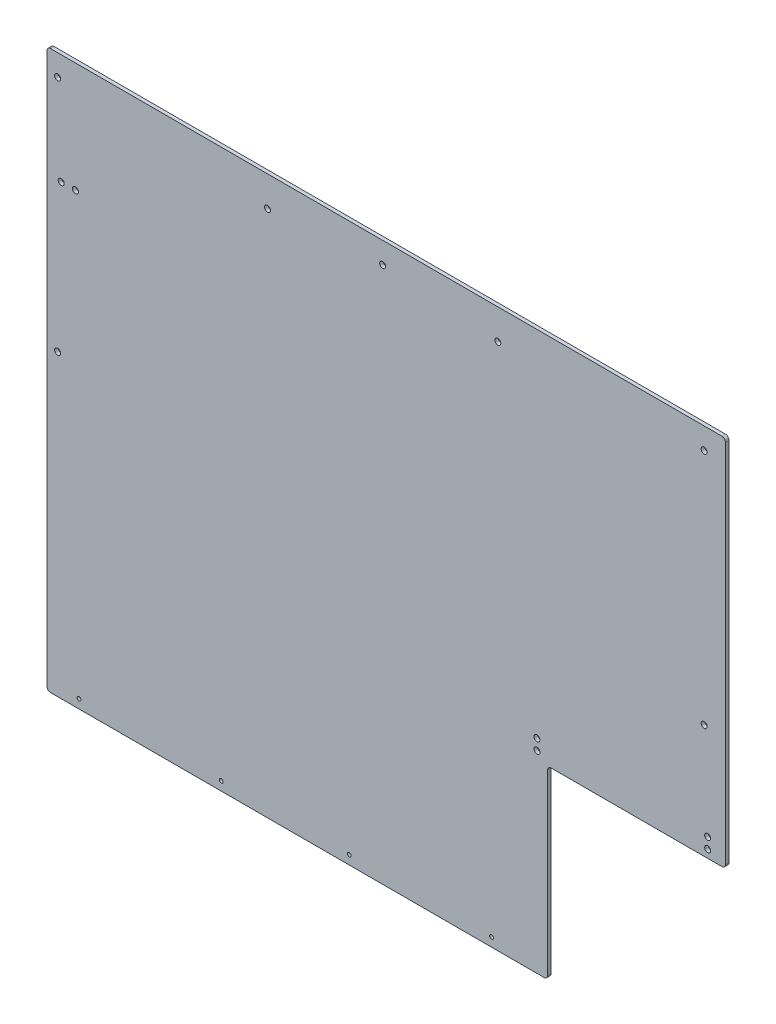
ISO-10303-21;
HEADER;
FILE_DESCRIPTION(('STEP AP214'),'2;1');
FILE_NAME('part.step','',(''),(''),'','','');
FILE_SCHEMA(('AUTOMOTIVE_DESIGN { 1 0 10303 214 1 1 1 1 }'));
ENDSEC;
DATA;
#1=APPLICATION_CONTEXT('core data for automotive mechanical design processes');
#2=APPLICATION_PROTOCOL_DEFINITION('international standard','automotive_design',2000,#1);
#3=PRODUCT_CONTEXT('',#1,'mechanical');
#4=PRODUCT('Part','Part','',(#3));
#5=PRODUCT_RELATED_PRODUCT_CATEGORY('part','',(#4));
#6=PRODUCT_DEFINITION_FORMATION('','',#4);
#7=PRODUCT_DEFINITION_CONTEXT('part definition',#1,'design');
#8=PRODUCT_DEFINITION('design','',#6,#7);
#9=PRODUCT_DEFINITION_SHAPE('','',#8);
#10=(LENGTH_UNIT() NAMED_UNIT(*) SI_UNIT(.MILLI.,.METRE.));
#11=(NAMED_UNIT(*) PLANE_ANGLE_UNIT() SI_UNIT($,.RADIAN.));
#12=(NAMED_UNIT(*) SI_UNIT($,.STERADIAN.) SOLID_ANGLE_UNIT());
#13=UNCERTAINTY_MEASURE_WITH_UNIT(LENGTH_MEASURE(1.E-05),#10,'distance_accuracy_value','');
#14=(GEOMETRIC_REPRESENTATION_CONTEXT(3) GLOBAL_UNCERTAINTY_ASSIGNED_CONTEXT((#13)) GLOBAL_UNIT_ASSIGNED_CONTEXT((#10,
#11,#12)) REPRESENTATION_CONTEXT('',''));
#15=CARTESIAN_POINT('',(0.,0.,0.));
#16=DIRECTION('',(0.,0.,1.));
#17=DIRECTION('',(1.,0.,0.));
#18=AXIS2_PLACEMENT_3D('',#15,#16,#17);
#19=CARTESIAN_POINT('',(611.98125,-988.3775,3.175));
#20=DIRECTION('',(-1.,0.,0.));
#21=DIRECTION('',(0.,0.,1.));
#22=AXIS2_PLACEMENT_3D('',#19,#20,#21);
#23=PLANE('',#22);
#24=DIRECTION('',(0.,1.,0.));
#25=VECTOR('',#24,1.);
#26=CARTESIAN_POINT('',(611.98125,-988.3775,-3.175));
#27=LINE('',#26,#25);
#28=CARTESIAN_POINT('',(611.98125,319.7225,-3.175));
#29=VERTEX_POINT('',#28);
#30=CARTESIAN_POINT('',(611.98125,972.5025,-3.175));
#31=VERTEX_POINT('',#30);
#32=EDGE_CURVE('E163',#29,#31,#27,.T.);
#33=ORIENTED_EDGE('',*,*,#32,.T.);
#34=DIRECTION('',(0.,0.,1.));
#35=VECTOR('',#34,1.);
#36=CARTESIAN_POINT('',(611.98125,972.5025,3.175));
#37=LINE('',#36,#35);
#38=CARTESIAN_POINT('',(611.98125,972.5025,3.175));
#39=VERTEX_POINT('',#38);
#40=EDGE_CURVE('E45',#31,#39,#37,.T.);
#41=ORIENTED_EDGE('',*,*,#40,.T.);
#42=DIRECTION('',(0.,1.,0.));
#43=VECTOR('',#42,1.);
#44=CARTESIAN_POINT('',(611.98125,-988.3775,3.175));
#45=LINE('',#44,#43);
#46=CARTESIAN_POINT('',(611.98125,319.7225,3.175));
#47=VERTEX_POINT('',#46);
#48=EDGE_CURVE('E172',#47,#39,#45,.T.);
#49=ORIENTED_EDGE('',*,*,#48,.F.);
#50=DIRECTION('',(0.,0.,1.));
#51=VECTOR('',#50,1.);
#52=CARTESIAN_POINT('',(611.98125,319.7225,3.175));
#53=LINE('',#52,#51);
#54=EDGE_CURVE('E208',#47,#29,#53,.F.);
#55=ORIENTED_EDGE('',*,*,#54,.T.);
#56=EDGE_LOOP('',(#33,#41,#49,#55));
#57=FACE_BOUND('',#56,.T.);
#58=ADVANCED_FACE('F36',(#57),#23,.F.);
#59=CARTESIAN_POINT('',(0.,0.,3.175));
#60=DIRECTION('',(0.,0.,-1.));
#61=DIRECTION('',(-1.,0.,0.));
#62=AXIS2_PLACEMENT_3D('',#59,#60,#61);
#63=PLANE('',#62);
#64=CARTESIAN_POINT('',(-592.93125,972.5025,3.175));
#65=DIRECTION('',(0.,0.,1.));
#66=DIRECTION('',(1.,0.,0.));
#67=AXIS2_PLACEMENT_3D('',#64,#65,#66);
#68=CIRCLE('',#67,6.35000000000002);
#69=CARTESIAN_POINT('',(-592.93125,978.8525,3.175));
#70=VERTEX_POINT('',#69);
#71=CARTESIAN_POINT('',(-599.28125,972.5025,3.175));
#72=VERTEX_POINT('',#71);
#73=EDGE_CURVE('E52',#70,#72,#68,.T.);
#74=ORIENTED_EDGE('',*,*,#73,.T.);
#75=DIRECTION('',(0.,-1.,0.));
#76=VECTOR('',#75,1.);
#77=CARTESIAN_POINT('',(-599.28125,-1.35371185980619E-13,3.175));
#78=LINE('',#77,#76);
#79=CARTESIAN_POINT('',(-599.28125,-10.4775000000001,3.175));
#80=VERTEX_POINT('',#79);
#81=EDGE_CURVE('E249',#72,#80,#78,.T.);
#82=ORIENTED_EDGE('',*,*,#81,.T.);
#83=CARTESIAN_POINT('',(-592.93125,-10.4775000000001,3.175));
#84=DIRECTION('',(0.,0.,1.));
#85=DIRECTION('',(1.,0.,0.));
#86=AXIS2_PLACEMENT_3D('',#83,#84,#85);
#87=CIRCLE('',#86,6.34999999999993);
#88=CARTESIAN_POINT('',(-592.93125,-16.8275000000001,3.175));
#89=VERTEX_POINT('',#88);
#90=EDGE_CURVE('E241',#89,#80,#87,.F.);
#91=ORIENTED_EDGE('',*,*,#90,.F.);
#92=DIRECTION('',(1.,0.,0.));
#93=VECTOR('',#92,1.);
#94=CARTESIAN_POINT('',(0.,-16.8275,3.175));
#95=LINE('',#94,#93);
#96=CARTESIAN_POINT('',(288.13125,-16.8275,3.175));
#97=VERTEX_POINT('',#96);
#98=EDGE_CURVE('E236',#89,#97,#95,.T.);
#99=ORIENTED_EDGE('',*,*,#98,.T.);
#100=CARTESIAN_POINT('',(288.13125,-10.4775,3.175));
#101=DIRECTION('',(0.,0.,1.));
#102=DIRECTION('',(1.,0.,0.));
#103=AXIS2_PLACEMENT_3D('',#100,#101,#102);
#104=CIRCLE('',#103,6.35000000000001);
#105=CARTESIAN_POINT('',(294.48125,-10.4775,3.175));
#106=VERTEX_POINT('',#105);
#107=EDGE_CURVE('E233',#106,#97,#104,.F.);
#108=ORIENTED_EDGE('',*,*,#107,.F.);
#109=DIRECTION('',(0.,-1.,0.));
#110=VECTOR('',#109,1.);
#111=CARTESIAN_POINT('',(294.48125,313.3725,3.175));
#112=LINE('',#111,#110);
#113=CARTESIAN_POINT('',(294.48125,307.0225,3.175));
#114=VERTEX_POINT('',#113);
#115=EDGE_CURVE('E147',#114,#106,#112,.T.);
#116=ORIENTED_EDGE('',*,*,#115,.F.);
#117=CARTESIAN_POINT('',(300.83125,307.0225,3.175));
#118=DIRECTION('',(0.,0.,-1.));
#119=DIRECTION('',(-1.,0.,0.));
#120=AXIS2_PLACEMENT_3D('',#117,#118,#119);
#121=CIRCLE('',#120,6.35);
#122=CARTESIAN_POINT('',(300.83125,313.3725,3.175));
#123=VERTEX_POINT('',#122);
#124=EDGE_CURVE('E186',#114,#123,#121,.T.);
#125=ORIENTED_EDGE('',*,*,#124,.T.);
#126=DIRECTION('',(-1.,0.,0.));
#127=VECTOR('',#126,1.);
#128=CARTESIAN_POINT('',(294.48125,313.3725,3.175));
#129=LINE('',#128,#127);
#130=CARTESIAN_POINT('',(605.63125,313.3725,3.175));
#131=VERTEX_POINT('',#130);
#132=EDGE_CURVE('E158',#131,#123,#129,.T.);
#133=ORIENTED_EDGE('',*,*,#132,.F.);
#134=CARTESIAN_POINT('',(605.63125,319.7225,3.175));
#135=DIRECTION('',(0.,0.,-1.));
#136=DIRECTION('',(-1.,0.,0.));
#137=AXIS2_PLACEMENT_3D('',#134,#135,#136);
#138=CIRCLE('',#137,6.35);
#139=EDGE_CURVE('E192',#131,#47,#138,.F.);
#140=ORIENTED_EDGE('',*,*,#139,.T.);
#141=ORIENTED_EDGE('',*,*,#48,.T.);
#142=CARTESIAN_POINT('',(605.63125,972.5025,3.175));
#143=DIRECTION('',(0.,0.,-1.));
#144=DIRECTION('',(-1.,0.,0.));
#145=AXIS2_PLACEMENT_3D('',#142,#143,#144);
#146=CIRCLE('',#145,6.35);
#147=CARTESIAN_POINT('',(605.63125,978.8525,3.175));
#148=VERTEX_POINT('',#147);
#149=EDGE_CURVE('E195',#39,#148,#146,.F.);
#150=ORIENTED_EDGE('',*,*,#149,.T.);
#151=DIRECTION('',(1.,0.,0.));
#152=VECTOR('',#151,1.);
#153=CARTESIAN_POINT('',(611.98125,978.8525,3.175));
#154=LINE('',#153,#152);
#155=EDGE_CURVE('E285',#70,#148,#154,.T.);
#156=ORIENTED_EDGE('',*,*,#155,.F.);
#157=EDGE_LOOP('',(#74,#82,#91,#99,#108,#116,#125,#133,#140,#141,#150,#156));
#158=FACE_BOUND('',#157,.T.);
#159=CARTESIAN_POINT('',(-573.88125,782.0025,3.175));
#160=DIRECTION('',(0.,0.,1.));
#161=DIRECTION('',(1.,0.,0.));
#162=AXIS2_PLACEMENT_3D('',#159,#160,#161);
#163=CIRCLE('',#162,5.35787600000004);
#164=CARTESIAN_POINT('',(-568.523374,782.0025,3.175));
#165=VERTEX_POINT('',#164);
#166=EDGE_CURVE('E258',#165,#165,#163,.T.);
#167=ORIENTED_EDGE('',*,*,#166,.F.);
#168=EDGE_LOOP('',(#167));
#169=FACE_BOUND('',#168,.T.);
#170=CARTESIAN_POINT('',(-548.48125,782.0025,3.175));
#171=DIRECTION('',(0.,0.,1.));
#172=DIRECTION('',(1.,0.,0.));
#173=AXIS2_PLACEMENT_3D('',#170,#171,#172);
#174=CIRCLE('',#173,5.35787600000004);
#175=CARTESIAN_POINT('',(-543.123374,782.0025,3.175));
#176=VERTEX_POINT('',#175);
#177=EDGE_CURVE('E277',#176,#176,#174,.T.);
#178=ORIENTED_EDGE('',*,*,#177,.F.);
#179=EDGE_LOOP('',(#178));
#180=FACE_BOUND('',#179,.T.);
#181=CARTESIAN_POINT('',(573.88125,940.7525,3.175));
#182=DIRECTION('',(0.,0.,1.));
#183=DIRECTION('',(1.,0.,0.));
#184=AXIS2_PLACEMENT_3D('',#181,#182,#183);
#185=CIRCLE('',#184,5.35787600000004);
#186=CARTESIAN_POINT('',(579.239126,940.7525,3.175));
#187=VERTEX_POINT('',#186);
#188=EDGE_CURVE('E289',#187,#187,#185,.T.);
#189=ORIENTED_EDGE('',*,*,#188,.F.);
#190=EDGE_LOOP('',(#189));
#191=FACE_BOUND('',#190,.T.);
#192=CARTESIAN_POINT('',(0.,940.7525,3.175));
#193=DIRECTION('',(0.,0.,1.));
#194=DIRECTION('',(1.,0.,0.));
#195=AXIS2_PLACEMENT_3D('',#192,#193,#194);
#196=CIRCLE('',#195,5.35787599999999);
#197=CARTESIAN_POINT('',(5.35787599999999,940.7525,3.175));
#198=VERTEX_POINT('',#197);
#199=EDGE_CURVE('E299',#198,#198,#196,.T.);
#200=ORIENTED_EDGE('',*,*,#199,.F.);
#201=EDGE_LOOP('',(#200));
#202=FACE_BOUND('',#201,.T.);
#203=CARTESIAN_POINT('',(-580.23125,940.7525,3.175));
#204=DIRECTION('',(0.,0.,1.));
#205=DIRECTION('',(1.,0.,0.));
#206=AXIS2_PLACEMENT_3D('',#203,#204,#205);
#207=CIRCLE('',#206,5.35787600000004);
#208=CARTESIAN_POINT('',(-574.873374,940.7525,3.175));
#209=VERTEX_POINT('',#208);
#210=EDGE_CURVE('E307',#209,#209,#207,.T.);
#211=ORIENTED_EDGE('',*,*,#210,.F.);
#212=EDGE_LOOP('',(#211));
#213=FACE_BOUND('',#212,.T.);
#214=CARTESIAN_POINT('',(-205.58125,924.8775,3.175));
#215=DIRECTION('',(0.,0.,1.));
#216=DIRECTION('',(1.,0.,0.));
#217=AXIS2_PLACEMENT_3D('',#214,#215,#216);
#218=CIRCLE('',#217,5.35787599999998);
#219=CARTESIAN_POINT('',(-200.223374,924.8775,3.175));
#220=VERTEX_POINT('',#219);
#221=EDGE_CURVE('E315',#220,#220,#218,.T.);
#222=ORIENTED_EDGE('',*,*,#221,.F.);
#223=EDGE_LOOP('',(#222));
#224=FACE_BOUND('',#223,.T.);
#225=CARTESIAN_POINT('',(205.58125,924.8775,3.175));
#226=DIRECTION('',(0.,0.,1.));
#227=DIRECTION('',(1.,0.,0.));
#228=AXIS2_PLACEMENT_3D('',#225,#226,#227);
#229=CIRCLE('',#228,5.35787599999998);
#230=CARTESIAN_POINT('',(210.939126,924.8775,3.175));
#231=VERTEX_POINT('',#230);
#232=EDGE_CURVE('E323',#231,#231,#229,.T.);
#233=ORIENTED_EDGE('',*,*,#232,.F.);
#234=EDGE_LOOP('',(#233));
#235=FACE_BOUND('',#234,.T.);
#236=CARTESIAN_POINT('',(275.43125,327.66,3.175));
#237=DIRECTION('',(0.,0.,1.));
#238=DIRECTION('',(1.,0.,0.));
#239=AXIS2_PLACEMENT_3D('',#236,#237,#238);
#240=CIRCLE('',#239,5.35787599999998);
#241=CARTESIAN_POINT('',(280.789126,327.66,3.175));
#242=VERTEX_POINT('',#241);
#243=EDGE_CURVE('E331',#242,#242,#240,.T.);
#244=ORIENTED_EDGE('',*,*,#243,.F.);
#245=EDGE_LOOP('',(#244));
#246=FACE_BOUND('',#245,.T.);
#247=CARTESIAN_POINT('',(580.23125,327.66,3.175));
#248=DIRECTION('',(0.,0.,1.));
#249=DIRECTION('',(1.,0.,0.));
#250=AXIS2_PLACEMENT_3D('',#247,#248,#249);
#251=CIRCLE('',#250,5.35787600000004);
#252=CARTESIAN_POINT('',(585.589126,327.66,3.175));
#253=VERTEX_POINT('',#252);
#254=EDGE_CURVE('E339',#253,#253,#251,.T.);
#255=ORIENTED_EDGE('',*,*,#254,.F.);
#256=EDGE_LOOP('',(#255));
#257=FACE_BOUND('',#256,.T.);
#258=CARTESIAN_POINT('',(580.23125,346.71,3.175));
#259=DIRECTION('',(0.,0.,1.));
#260=DIRECTION('',(1.,0.,0.));
#261=AXIS2_PLACEMENT_3D('',#258,#259,#260);
#262=CIRCLE('',#261,5.35787600000004);
#263=CARTESIAN_POINT('',(585.589126,346.71,3.175));
#264=VERTEX_POINT('',#263);
#265=EDGE_CURVE('E347',#264,#264,#262,.T.);
#266=ORIENTED_EDGE('',*,*,#265,.F.);
#267=EDGE_LOOP('',(#266));
#268=FACE_BOUND('',#267,.T.);
#269=CARTESIAN_POINT('',(275.43125,346.71,3.175));
#270=DIRECTION('',(0.,0.,1.));
#271=DIRECTION('',(1.,0.,0.));
#272=AXIS2_PLACEMENT_3D('',#269,#270,#271);
#273=CIRCLE('',#272,5.35787599999998);
#274=CARTESIAN_POINT('',(280.789126,346.71,3.175));
#275=VERTEX_POINT('',#274);
#276=EDGE_CURVE('E355',#275,#275,#273,.T.);
#277=ORIENTED_EDGE('',*,*,#276,.F.);
#278=EDGE_LOOP('',(#277));
#279=FACE_BOUND('',#278,.T.);
#280=CARTESIAN_POINT('',(573.88125,516.5725,3.175));
#281=DIRECTION('',(0.,0.,1.));
#282=DIRECTION('',(1.,0.,0.));
#283=AXIS2_PLACEMENT_3D('',#280,#281,#282);
#284=CIRCLE('',#283,5.35787600000004);
#285=CARTESIAN_POINT('',(579.239126,516.5725,3.175));
#286=VERTEX_POINT('',#285);
#287=EDGE_CURVE('E363',#286,#286,#284,.T.);
#288=ORIENTED_EDGE('',*,*,#287,.F.);
#289=EDGE_LOOP('',(#288));
#290=FACE_BOUND('',#289,.T.);
#291=CARTESIAN_POINT('',(-580.23125,516.5725,3.175));
#292=DIRECTION('',(0.,0.,1.));
#293=DIRECTION('',(1.,0.,0.));
#294=AXIS2_PLACEMENT_3D('',#291,#292,#293);
#295=CIRCLE('',#294,5.35787600000004);
#296=CARTESIAN_POINT('',(-574.873374,516.5725,3.175));
#297=VERTEX_POINT('',#296);
#298=EDGE_CURVE('E371',#297,#297,#295,.T.);
#299=ORIENTED_EDGE('',*,*,#298,.F.);
#300=EDGE_LOOP('',(#299));
#301=FACE_BOUND('',#300,.T.);
#302=CARTESIAN_POINT('',(-542.13125,-0.952500000000134,3.175));
#303=DIRECTION('',(0.,0.,1.));
#304=DIRECTION('',(1.,0.,0.));
#305=AXIS2_PLACEMENT_3D('',#302,#303,#304);
#306=CIRCLE('',#305,3.3782);
#307=CARTESIAN_POINT('',(-538.75305,-0.952500000000134,3.175));
#308=VERTEX_POINT('',#307);
#309=EDGE_CURVE('E379',#308,#308,#306,.T.);
#310=ORIENTED_EDGE('',*,*,#309,.F.);
#311=EDGE_LOOP('',(#310));
#312=FACE_BOUND('',#311,.T.);
#313=CARTESIAN_POINT('',(-288.13125,-0.952500000000134,3.175));
#314=DIRECTION('',(0.,0.,1.));
#315=DIRECTION('',(1.,0.,0.));
#316=AXIS2_PLACEMENT_3D('',#313,#314,#315);
#317=CIRCLE('',#316,3.3782);
#318=CARTESIAN_POINT('',(-284.75305,-0.952500000000134,3.175));
#319=VERTEX_POINT('',#318);
#320=EDGE_CURVE('E387',#319,#319,#317,.T.);
#321=ORIENTED_EDGE('',*,*,#320,.F.);
#322=EDGE_LOOP('',(#321));
#323=FACE_BOUND('',#322,.T.);
#324=CARTESIAN_POINT('',(-59.5312500000002,-0.952500000000134,3.175));
#325=DIRECTION('',(0.,0.,1.));
#326=DIRECTION('',(1.,0.,0.));
#327=AXIS2_PLACEMENT_3D('',#324,#325,#326);
#328=CIRCLE('',#327,3.3782);
#329=CARTESIAN_POINT('',(-56.1530500000002,-0.952500000000134,3.175));
#330=VERTEX_POINT('',#329);
#331=EDGE_CURVE('E395',#330,#330,#328,.T.);
#332=ORIENTED_EDGE('',*,*,#331,.F.);
#333=EDGE_LOOP('',(#332));
#334=FACE_BOUND('',#333,.T.);
#335=CARTESIAN_POINT('',(194.46875,-0.952500000000134,3.175));
#336=DIRECTION('',(0.,0.,1.));
#337=DIRECTION('',(1.,0.,0.));
#338=AXIS2_PLACEMENT_3D('',#335,#336,#337);
#339=CIRCLE('',#338,3.3782);
#340=CARTESIAN_POINT('',(197.84695,-0.952500000000134,3.175));
#341=VERTEX_POINT('',#340);
#342=EDGE_CURVE('E402',#341,#341,#339,.T.);
#343=ORIENTED_EDGE('',*,*,#342,.F.);
#344=EDGE_LOOP('',(#343));
#345=FACE_BOUND('',#344,.T.);
#346=ADVANCED_FACE('F220',(#158,#169,#180,#191,#202,#213,#224,#235,#246,#257,#268,#279,#290,
#301,#312,#323,#334,#345),#63,.F.);
#347=CARTESIAN_POINT('',(0.,0.,-3.175));
#348=DIRECTION('',(0.,0.,-1.));
#349=DIRECTION('',(-1.,0.,0.));
#350=AXIS2_PLACEMENT_3D('',#347,#348,#349);
#351=PLANE('',#350);
#352=CARTESIAN_POINT('',(-573.88125,782.0025,-3.175));
#353=DIRECTION('',(0.,0.,1.));
#354=DIRECTION('',(1.,0.,0.));
#355=AXIS2_PLACEMENT_3D('',#352,#353,#354);
#356=CIRCLE('',#355,5.35787600000004);
#357=CARTESIAN_POINT('',(-568.523374,782.0025,-3.175));
#358=VERTEX_POINT('',#357);
#359=EDGE_CURVE('E273',#358,#358,#356,.T.);
#360=ORIENTED_EDGE('',*,*,#359,.T.);
#361=EDGE_LOOP('',(#360));
#362=FACE_BOUND('',#361,.T.);
#363=CARTESIAN_POINT('',(-548.48125,782.0025,-3.175));
#364=DIRECTION('',(0.,0.,1.));
#365=DIRECTION('',(1.,0.,0.));
#366=AXIS2_PLACEMENT_3D('',#363,#364,#365);
#367=CIRCLE('',#366,5.35787600000004);
#368=CARTESIAN_POINT('',(-543.123374,782.0025,-3.175));
#369=VERTEX_POINT('',#368);
#370=EDGE_CURVE('E281',#369,#369,#367,.T.);
#371=ORIENTED_EDGE('',*,*,#370,.T.);
#372=EDGE_LOOP('',(#371));
#373=FACE_BOUND('',#372,.T.);
#374=DIRECTION('',(0.,-1.,0.));
#375=VECTOR('',#374,1.);
#376=CARTESIAN_POINT('',(-599.28125,-1.35371185980619E-13,-3.175));
#377=LINE('',#376,#375);
#378=CARTESIAN_POINT('',(-599.28125,972.5025,-3.175));
#379=VERTEX_POINT('',#378);
#380=CARTESIAN_POINT('',(-599.28125,-10.4775000000001,-3.175));
#381=VERTEX_POINT('',#380);
#382=EDGE_CURVE('E450',#379,#381,#377,.T.);
#383=ORIENTED_EDGE('',*,*,#382,.F.);
#384=CARTESIAN_POINT('',(-592.93125,972.5025,-3.175));
#385=DIRECTION('',(0.,0.,1.));
#386=DIRECTION('',(1.,0.,0.));
#387=AXIS2_PLACEMENT_3D('',#384,#385,#386);
#388=CIRCLE('',#387,6.35000000000002);
#389=CARTESIAN_POINT('',(-592.93125,978.8525,-3.175));
#390=VERTEX_POINT('',#389);
#391=EDGE_CURVE('E149',#390,#379,#388,.T.);
#392=ORIENTED_EDGE('',*,*,#391,.F.);
#393=DIRECTION('',(1.,0.,0.));
#394=VECTOR('',#393,1.);
#395=CARTESIAN_POINT('',(611.98125,978.8525,-3.175));
#396=LINE('',#395,#394);
#397=CARTESIAN_POINT('',(605.63125,978.8525,-3.175));
#398=VERTEX_POINT('',#397);
#399=EDGE_CURVE('E286',#390,#398,#396,.T.);
#400=ORIENTED_EDGE('',*,*,#399,.T.);
#401=CARTESIAN_POINT('',(605.63125,972.5025,-3.175));
#402=DIRECTION('',(0.,0.,-1.));
#403=DIRECTION('',(-1.,0.,0.));
#404=AXIS2_PLACEMENT_3D('',#401,#402,#403);
#405=CIRCLE('',#404,6.35);
#406=EDGE_CURVE('E201',#398,#31,#405,.T.);
#407=ORIENTED_EDGE('',*,*,#406,.T.);
#408=ORIENTED_EDGE('',*,*,#32,.F.);
#409=CARTESIAN_POINT('',(605.63125,319.7225,-3.175));
#410=DIRECTION('',(0.,0.,-1.));
#411=DIRECTION('',(-1.,0.,0.));
#412=AXIS2_PLACEMENT_3D('',#409,#410,#411);
#413=CIRCLE('',#412,6.35);
#414=CARTESIAN_POINT('',(605.63125,313.3725,-3.175));
#415=VERTEX_POINT('',#414);
#416=EDGE_CURVE('E60',#29,#415,#413,.T.);
#417=ORIENTED_EDGE('',*,*,#416,.T.);
#418=DIRECTION('',(-1.,0.,0.));
#419=VECTOR('',#418,1.);
#420=CARTESIAN_POINT('',(294.48125,313.3725,-3.175));
#421=LINE('',#420,#419);
#422=CARTESIAN_POINT('',(300.83125,313.3725,-3.175));
#423=VERTEX_POINT('',#422);
#424=EDGE_CURVE('E157',#415,#423,#421,.T.);
#425=ORIENTED_EDGE('',*,*,#424,.T.);
#426=CARTESIAN_POINT('',(300.83125,307.0225,-3.175));
#427=DIRECTION('',(0.,0.,-1.));
#428=DIRECTION('',(-1.,0.,0.));
#429=AXIS2_PLACEMENT_3D('',#426,#427,#428);
#430=CIRCLE('',#429,6.35);
#431=CARTESIAN_POINT('',(294.48125,307.0225,-3.175));
#432=VERTEX_POINT('',#431);
#433=EDGE_CURVE('E155',#423,#432,#430,.F.);
#434=ORIENTED_EDGE('',*,*,#433,.T.);
#435=DIRECTION('',(0.,-1.,0.));
#436=VECTOR('',#435,1.);
#437=CARTESIAN_POINT('',(294.48125,313.3725,-3.175));
#438=LINE('',#437,#436);
#439=CARTESIAN_POINT('',(294.48125,-10.4775,-3.175));
#440=VERTEX_POINT('',#439);
#441=EDGE_CURVE('E144',#432,#440,#438,.T.);
#442=ORIENTED_EDGE('',*,*,#441,.T.);
#443=CARTESIAN_POINT('',(288.13125,-10.4775,-3.175));
#444=DIRECTION('',(0.,0.,1.));
#445=DIRECTION('',(1.,0.,0.));
#446=AXIS2_PLACEMENT_3D('',#443,#444,#445);
#447=CIRCLE('',#446,6.35000000000001);
#448=CARTESIAN_POINT('',(288.13125,-16.8275,-3.175));
#449=VERTEX_POINT('',#448);
#450=EDGE_CURVE('E127',#440,#449,#447,.F.);
#451=ORIENTED_EDGE('',*,*,#450,.T.);
#452=DIRECTION('',(1.,0.,0.));
#453=VECTOR('',#452,1.);
#454=CARTESIAN_POINT('',(0.,-16.8275,-3.175));
#455=LINE('',#454,#453);
#456=CARTESIAN_POINT('',(-592.93125,-16.8275000000001,-3.175));
#457=VERTEX_POINT('',#456);
#458=EDGE_CURVE('E137',#457,#449,#455,.T.);
#459=ORIENTED_EDGE('',*,*,#458,.F.);
#460=CARTESIAN_POINT('',(-592.93125,-10.4775000000001,-3.175));
#461=DIRECTION('',(0.,0.,1.));
#462=DIRECTION('',(1.,0.,0.));
#463=AXIS2_PLACEMENT_3D('',#460,#461,#462);
#464=CIRCLE('',#463,6.34999999999993);
#465=EDGE_CURVE('E455',#457,#381,#464,.F.);
#466=ORIENTED_EDGE('',*,*,#465,.T.);
#467=EDGE_LOOP('',(#383,#392,#400,#407,#408,#417,#425,#434,#442,#451,#459,#466));
#468=FACE_BOUND('',#467,.T.);
#469=CARTESIAN_POINT('',(573.88125,940.7525,-3.175));
#470=DIRECTION('',(0.,0.,1.));
#471=DIRECTION('',(1.,0.,0.));
#472=AXIS2_PLACEMENT_3D('',#469,#470,#471);
#473=CIRCLE('',#472,5.35787600000004);
#474=CARTESIAN_POINT('',(579.239126,940.7525,-3.175));
#475=VERTEX_POINT('',#474);
#476=EDGE_CURVE('E295',#475,#475,#473,.T.);
#477=ORIENTED_EDGE('',*,*,#476,.T.);
#478=EDGE_LOOP('',(#477));
#479=FACE_BOUND('',#478,.T.);
#480=CARTESIAN_POINT('',(0.,940.7525,-3.175));
#481=DIRECTION('',(0.,0.,1.));
#482=DIRECTION('',(1.,0.,0.));
#483=AXIS2_PLACEMENT_3D('',#480,#481,#482);
#484=CIRCLE('',#483,5.35787599999999);
#485=CARTESIAN_POINT('',(5.35787599999999,940.7525,-3.175));
#486=VERTEX_POINT('',#485);
#487=EDGE_CURVE('E303',#486,#486,#484,.T.);
#488=ORIENTED_EDGE('',*,*,#487,.T.);
#489=EDGE_LOOP('',(#488));
#490=FACE_BOUND('',#489,.T.);
#491=CARTESIAN_POINT('',(-580.23125,940.7525,-3.175));
#492=DIRECTION('',(0.,0.,1.));
#493=DIRECTION('',(1.,0.,0.));
#494=AXIS2_PLACEMENT_3D('',#491,#492,#493);
#495=CIRCLE('',#494,5.35787600000004);
#496=CARTESIAN_POINT('',(-574.873374,940.7525,-3.175));
#497=VERTEX_POINT('',#496);
#498=EDGE_CURVE('E311',#497,#497,#495,.T.);
#499=ORIENTED_EDGE('',*,*,#498,.T.);
#500=EDGE_LOOP('',(#499));
#501=FACE_BOUND('',#500,.T.);
#502=CARTESIAN_POINT('',(-205.58125,924.8775,-3.175));
#503=DIRECTION('',(0.,0.,1.));
#504=DIRECTION('',(1.,0.,0.));
#505=AXIS2_PLACEMENT_3D('',#502,#503,#504);
#506=CIRCLE('',#505,5.35787599999998);
#507=CARTESIAN_POINT('',(-200.223374,924.8775,-3.175));
#508=VERTEX_POINT('',#507);
#509=EDGE_CURVE('E319',#508,#508,#506,.T.);
#510=ORIENTED_EDGE('',*,*,#509,.T.);
#511=EDGE_LOOP('',(#510));
#512=FACE_BOUND('',#511,.T.);
#513=CARTESIAN_POINT('',(205.58125,924.8775,-3.175));
#514=DIRECTION('',(0.,0.,1.));
#515=DIRECTION('',(1.,0.,0.));
#516=AXIS2_PLACEMENT_3D('',#513,#514,#515);
#517=CIRCLE('',#516,5.35787599999998);
#518=CARTESIAN_POINT('',(210.939126,924.8775,-3.175));
#519=VERTEX_POINT('',#518);
#520=EDGE_CURVE('E327',#519,#519,#517,.T.);
#521=ORIENTED_EDGE('',*,*,#520,.T.);
#522=EDGE_LOOP('',(#521));
#523=FACE_BOUND('',#522,.T.);
#524=CARTESIAN_POINT('',(275.43125,327.66,-3.175));
#525=DIRECTION('',(0.,0.,1.));
#526=DIRECTION('',(1.,0.,0.));
#527=AXIS2_PLACEMENT_3D('',#524,#525,#526);
#528=CIRCLE('',#527,5.35787599999998);
#529=CARTESIAN_POINT('',(280.789126,327.66,-3.175));
#530=VERTEX_POINT('',#529);
#531=EDGE_CURVE('E335',#530,#530,#528,.T.);
#532=ORIENTED_EDGE('',*,*,#531,.T.);
#533=EDGE_LOOP('',(#532));
#534=FACE_BOUND('',#533,.T.);
#535=CARTESIAN_POINT('',(580.23125,327.66,-3.175));
#536=DIRECTION('',(0.,0.,1.));
#537=DIRECTION('',(1.,0.,0.));
#538=AXIS2_PLACEMENT_3D('',#535,#536,#537);
#539=CIRCLE('',#538,5.35787600000004);
#540=CARTESIAN_POINT('',(585.589126,327.66,-3.175));
#541=VERTEX_POINT('',#540);
#542=EDGE_CURVE('E343',#541,#541,#539,.T.);
#543=ORIENTED_EDGE('',*,*,#542,.T.);
#544=EDGE_LOOP('',(#543));
#545=FACE_BOUND('',#544,.T.);
#546=CARTESIAN_POINT('',(580.23125,346.71,-3.175));
#547=DIRECTION('',(0.,0.,1.));
#548=DIRECTION('',(1.,0.,0.));
#549=AXIS2_PLACEMENT_3D('',#546,#547,#548);
#550=CIRCLE('',#549,5.35787600000004);
#551=CARTESIAN_POINT('',(585.589126,346.71,-3.175));
#552=VERTEX_POINT('',#551);
#553=EDGE_CURVE('E351',#552,#552,#550,.T.);
#554=ORIENTED_EDGE('',*,*,#553,.T.);
#555=EDGE_LOOP('',(#554));
#556=FACE_BOUND('',#555,.T.);
#557=CARTESIAN_POINT('',(275.43125,346.71,-3.175));
#558=DIRECTION('',(0.,0.,1.));
#559=DIRECTION('',(1.,0.,0.));
#560=AXIS2_PLACEMENT_3D('',#557,#558,#559);
#561=CIRCLE('',#560,5.35787599999998);
#562=CARTESIAN_POINT('',(280.789126,346.71,-3.175));
#563=VERTEX_POINT('',#562);
#564=EDGE_CURVE('E359',#563,#563,#561,.T.);
#565=ORIENTED_EDGE('',*,*,#564,.T.);
#566=EDGE_LOOP('',(#565));
#567=FACE_BOUND('',#566,.T.);
#568=CARTESIAN_POINT('',(573.88125,516.5725,-3.175));
#569=DIRECTION('',(0.,0.,1.));
#570=DIRECTION('',(1.,0.,0.));
#571=AXIS2_PLACEMENT_3D('',#568,#569,#570);
#572=CIRCLE('',#571,5.35787600000004);
#573=CARTESIAN_POINT('',(579.239126,516.5725,-3.175));
#574=VERTEX_POINT('',#573);
#575=EDGE_CURVE('E367',#574,#574,#572,.T.);
#576=ORIENTED_EDGE('',*,*,#575,.T.);
#577=EDGE_LOOP('',(#576));
#578=FACE_BOUND('',#577,.T.);
#579=CARTESIAN_POINT('',(-580.23125,516.5725,-3.175));
#580=DIRECTION('',(0.,0.,1.));
#581=DIRECTION('',(1.,0.,0.));
#582=AXIS2_PLACEMENT_3D('',#579,#580,#581);
#583=CIRCLE('',#582,5.35787600000004);
#584=CARTESIAN_POINT('',(-574.873374,516.5725,-3.175));
#585=VERTEX_POINT('',#584);
#586=EDGE_CURVE('E375',#585,#585,#583,.T.);
#587=ORIENTED_EDGE('',*,*,#586,.T.);
#588=EDGE_LOOP('',(#587));
#589=FACE_BOUND('',#588,.T.);
#590=CARTESIAN_POINT('',(-542.13125,-0.952500000000134,-3.175));
#591=DIRECTION('',(0.,0.,1.));
#592=DIRECTION('',(1.,0.,0.));
#593=AXIS2_PLACEMENT_3D('',#590,#591,#592);
#594=CIRCLE('',#593,3.3782);
#595=CARTESIAN_POINT('',(-538.75305,-0.952500000000134,-3.175));
#596=VERTEX_POINT('',#595);
#597=EDGE_CURVE('E383',#596,#596,#594,.T.);
#598=ORIENTED_EDGE('',*,*,#597,.T.);
#599=EDGE_LOOP('',(#598));
#600=FACE_BOUND('',#599,.T.);
#601=CARTESIAN_POINT('',(-288.13125,-0.952500000000134,-3.175));
#602=DIRECTION('',(0.,0.,1.));
#603=DIRECTION('',(1.,0.,0.));
#604=AXIS2_PLACEMENT_3D('',#601,#602,#603);
#605=CIRCLE('',#604,3.3782);
#606=CARTESIAN_POINT('',(-284.75305,-0.952500000000134,-3.175));
#607=VERTEX_POINT('',#606);
#608=EDGE_CURVE('E391',#607,#607,#605,.T.);
#609=ORIENTED_EDGE('',*,*,#608,.T.);
#610=EDGE_LOOP('',(#609));
#611=FACE_BOUND('',#610,.T.);
#612=CARTESIAN_POINT('',(-59.5312500000002,-0.952500000000134,-3.175));
#613=DIRECTION('',(0.,0.,1.));
#614=DIRECTION('',(1.,0.,0.));
#615=AXIS2_PLACEMENT_3D('',#612,#613,#614);
#616=CIRCLE('',#615,3.3782);
#617=CARTESIAN_POINT('',(-56.1530500000002,-0.952500000000134,-3.175));
#618=VERTEX_POINT('',#617);
#619=EDGE_CURVE('E399',#618,#618,#616,.T.);
#620=ORIENTED_EDGE('',*,*,#619,.T.);
#621=EDGE_LOOP('',(#620));
#622=FACE_BOUND('',#621,.T.);
#623=CARTESIAN_POINT('',(194.46875,-0.952500000000134,-3.175));
#624=DIRECTION('',(0.,0.,1.));
#625=DIRECTION('',(1.,0.,0.));
#626=AXIS2_PLACEMENT_3D('',#623,#624,#625);
#627=CIRCLE('',#626,3.3782);
#628=CARTESIAN_POINT('',(197.84695,-0.952500000000134,-3.175));
#629=VERTEX_POINT('',#628);
#630=EDGE_CURVE('E167',#629,#629,#627,.T.);
#631=ORIENTED_EDGE('',*,*,#630,.T.);
#632=EDGE_LOOP('',(#631));
#633=FACE_BOUND('',#632,.T.);
#634=ADVANCED_FACE('F152',(#362,#373,#468,#479,#490,#501,#512,#523,#534,#545,#556,#567,#578,
#589,#600,#611,#622,#633),#351,.T.);
#635=CARTESIAN_POINT('',(294.48125,313.3725,-3.175));
#636=DIRECTION('',(-1.,0.,0.));
#637=DIRECTION('',(0.,0.,1.));
#638=AXIS2_PLACEMENT_3D('',#635,#636,#637);
#639=PLANE('',#638);
#640=ORIENTED_EDGE('',*,*,#115,.T.);
#641=DIRECTION('',(0.,0.,1.));
#642=VECTOR('',#641,1.);
#643=CARTESIAN_POINT('',(294.48125,-10.4775,-3.175));
#644=LINE('',#643,#642);
#645=EDGE_CURVE('E131',#440,#106,#644,.T.);
#646=ORIENTED_EDGE('',*,*,#645,.F.);
#647=ORIENTED_EDGE('',*,*,#441,.F.);
#648=DIRECTION('',(0.,0.,1.));
#649=VECTOR('',#648,1.);
#650=CARTESIAN_POINT('',(294.48125,307.0225,3.175));
#651=LINE('',#650,#649);
#652=EDGE_CURVE('E176',#432,#114,#651,.T.);
#653=ORIENTED_EDGE('',*,*,#652,.T.);
#654=EDGE_LOOP('',(#640,#646,#647,#653));
#655=FACE_BOUND('',#654,.T.);
#656=ADVANCED_FACE('F142',(#655),#639,.F.);
#657=CARTESIAN_POINT('',(294.48125,313.3725,-3.175));
#658=DIRECTION('',(0.,1.,0.));
#659=DIRECTION('',(0.,0.,1.));
#660=AXIS2_PLACEMENT_3D('',#657,#658,#659);
#661=PLANE('',#660);
#662=ORIENTED_EDGE('',*,*,#424,.F.);
#663=DIRECTION('',(0.,0.,1.));
#664=VECTOR('',#663,1.);
#665=CARTESIAN_POINT('',(605.63125,313.3725,-3.175));
#666=LINE('',#665,#664);
#667=EDGE_CURVE('E11',#415,#131,#666,.T.);
#668=ORIENTED_EDGE('',*,*,#667,.T.);
#669=ORIENTED_EDGE('',*,*,#132,.T.);
#670=DIRECTION('',(0.,0.,1.));
#671=VECTOR('',#670,1.);
#672=CARTESIAN_POINT('',(300.83125,313.3725,-3.175));
#673=LINE('',#672,#671);
#674=EDGE_CURVE('E182',#123,#423,#673,.F.);
#675=ORIENTED_EDGE('',*,*,#674,.T.);
#676=EDGE_LOOP('',(#662,#668,#669,#675));
#677=FACE_BOUND('',#676,.T.);
#678=ADVANCED_FACE('F228',(#677),#661,.F.);
#679=CARTESIAN_POINT('',(194.46875,-0.952500000000134,3.175));
#680=DIRECTION('',(0.,0.,1.));
#681=DIRECTION('',(1.,0.,0.));
#682=AXIS2_PLACEMENT_3D('',#679,#680,#681);
#683=CYLINDRICAL_SURFACE('',#682,3.3782);
#684=ORIENTED_EDGE('',*,*,#630,.F.);
#685=EDGE_LOOP('',(#684));
#686=FACE_BOUND('',#685,.T.);
#687=ORIENTED_EDGE('',*,*,#342,.T.);
#688=EDGE_LOOP('',(#687));
#689=FACE_BOUND('',#688,.T.);
#690=ADVANCED_FACE('F414',(#686,#689),#683,.F.);
#691=CARTESIAN_POINT('',(-59.5312500000002,-0.952500000000134,3.175));
#692=DIRECTION('',(0.,0.,1.));
#693=DIRECTION('',(1.,0.,0.));
#694=AXIS2_PLACEMENT_3D('',#691,#692,#693);
#695=CYLINDRICAL_SURFACE('',#694,3.3782);
#696=ORIENTED_EDGE('',*,*,#619,.F.);
#697=EDGE_LOOP('',(#696));
#698=FACE_BOUND('',#697,.T.);
#699=ORIENTED_EDGE('',*,*,#331,.T.);
#700=EDGE_LOOP('',(#699));
#701=FACE_BOUND('',#700,.T.);
#702=ADVANCED_FACE('F416',(#698,#701),#695,.F.);
#703=CARTESIAN_POINT('',(-288.13125,-0.952500000000134,3.175));
#704=DIRECTION('',(0.,0.,1.));
#705=DIRECTION('',(1.,0.,0.));
#706=AXIS2_PLACEMENT_3D('',#703,#704,#705);
#707=CYLINDRICAL_SURFACE('',#706,3.3782);
#708=ORIENTED_EDGE('',*,*,#608,.F.);
#709=EDGE_LOOP('',(#708));
#710=FACE_BOUND('',#709,.T.);
#711=ORIENTED_EDGE('',*,*,#320,.T.);
#712=EDGE_LOOP('',(#711));
#713=FACE_BOUND('',#712,.T.);
#714=ADVANCED_FACE('F422',(#710,#713),#707,.F.);
#715=CARTESIAN_POINT('',(-542.13125,-0.952500000000134,3.175));
#716=DIRECTION('',(0.,0.,1.));
#717=DIRECTION('',(1.,0.,0.));
#718=AXIS2_PLACEMENT_3D('',#715,#716,#717);
#719=CYLINDRICAL_SURFACE('',#718,3.3782);
#720=ORIENTED_EDGE('',*,*,#597,.F.);
#721=EDGE_LOOP('',(#720));
#722=FACE_BOUND('',#721,.T.);
#723=ORIENTED_EDGE('',*,*,#309,.T.);
#724=EDGE_LOOP('',(#723));
#725=FACE_BOUND('',#724,.T.);
#726=ADVANCED_FACE('F533',(#722,#725),#719,.F.);
#727=CARTESIAN_POINT('',(-580.23125,516.5725,3.175));
#728=DIRECTION('',(0.,0.,1.));
#729=DIRECTION('',(1.,0.,0.));
#730=AXIS2_PLACEMENT_3D('',#727,#728,#729);
#731=CYLINDRICAL_SURFACE('',#730,5.35787600000004);
#732=ORIENTED_EDGE('',*,*,#586,.F.);
#733=EDGE_LOOP('',(#732));
#734=FACE_BOUND('',#733,.T.);
#735=ORIENTED_EDGE('',*,*,#298,.T.);
#736=EDGE_LOOP('',(#735));
#737=FACE_BOUND('',#736,.T.);
#738=ADVANCED_FACE('F529',(#734,#737),#731,.F.);
#739=CARTESIAN_POINT('',(573.88125,516.5725,3.175));
#740=DIRECTION('',(0.,0.,1.));
#741=DIRECTION('',(1.,0.,0.));
#742=AXIS2_PLACEMENT_3D('',#739,#740,#741);
#743=CYLINDRICAL_SURFACE('',#742,5.35787600000004);
#744=ORIENTED_EDGE('',*,*,#575,.F.);
#745=EDGE_LOOP('',(#744));
#746=FACE_BOUND('',#745,.T.);
#747=ORIENTED_EDGE('',*,*,#287,.T.);
#748=EDGE_LOOP('',(#747));
#749=FACE_BOUND('',#748,.T.);
#750=ADVANCED_FACE('F525',(#746,#749),#743,.F.);
#751=CARTESIAN_POINT('',(275.43125,346.71,3.175));
#752=DIRECTION('',(0.,0.,1.));
#753=DIRECTION('',(1.,0.,0.));
#754=AXIS2_PLACEMENT_3D('',#751,#752,#753);
#755=CYLINDRICAL_SURFACE('',#754,5.35787599999998);
#756=ORIENTED_EDGE('',*,*,#564,.F.);
#757=EDGE_LOOP('',(#756));
#758=FACE_BOUND('',#757,.T.);
#759=ORIENTED_EDGE('',*,*,#276,.T.);
#760=EDGE_LOOP('',(#759));
#761=FACE_BOUND('',#760,.T.);
#762=ADVANCED_FACE('F521',(#758,#761),#755,.F.);
#763=CARTESIAN_POINT('',(580.23125,346.71,3.175));
#764=DIRECTION('',(0.,0.,1.));
#765=DIRECTION('',(1.,0.,0.));
#766=AXIS2_PLACEMENT_3D('',#763,#764,#765);
#767=CYLINDRICAL_SURFACE('',#766,5.35787600000004);
#768=ORIENTED_EDGE('',*,*,#553,.F.);
#769=EDGE_LOOP('',(#768));
#770=FACE_BOUND('',#769,.T.);
#771=ORIENTED_EDGE('',*,*,#265,.T.);
#772=EDGE_LOOP('',(#771));
#773=FACE_BOUND('',#772,.T.);
#774=ADVANCED_FACE('F517',(#770,#773),#767,.F.);
#775=CARTESIAN_POINT('',(580.23125,327.66,3.175));
#776=DIRECTION('',(0.,0.,1.));
#777=DIRECTION('',(1.,0.,0.));
#778=AXIS2_PLACEMENT_3D('',#775,#776,#777);
#779=CYLINDRICAL_SURFACE('',#778,5.35787600000004);
#780=ORIENTED_EDGE('',*,*,#542,.F.);
#781=EDGE_LOOP('',(#780));
#782=FACE_BOUND('',#781,.T.);
#783=ORIENTED_EDGE('',*,*,#254,.T.);
#784=EDGE_LOOP('',(#783));
#785=FACE_BOUND('',#784,.T.);
#786=ADVANCED_FACE('F513',(#782,#785),#779,.F.);
#787=CARTESIAN_POINT('',(275.43125,327.66,3.175));
#788=DIRECTION('',(0.,0.,1.));
#789=DIRECTION('',(1.,0.,0.));
#790=AXIS2_PLACEMENT_3D('',#787,#788,#789);
#791=CYLINDRICAL_SURFACE('',#790,5.35787599999998);
#792=ORIENTED_EDGE('',*,*,#531,.F.);
#793=EDGE_LOOP('',(#792));
#794=FACE_BOUND('',#793,.T.);
#795=ORIENTED_EDGE('',*,*,#243,.T.);
#796=EDGE_LOOP('',(#795));
#797=FACE_BOUND('',#796,.T.);
#798=ADVANCED_FACE('F509',(#794,#797),#791,.F.);
#799=CARTESIAN_POINT('',(205.58125,924.8775,3.175));
#800=DIRECTION('',(0.,0.,1.));
#801=DIRECTION('',(1.,0.,0.));
#802=AXIS2_PLACEMENT_3D('',#799,#800,#801);
#803=CYLINDRICAL_SURFACE('',#802,5.35787599999998);
#804=ORIENTED_EDGE('',*,*,#520,.F.);
#805=EDGE_LOOP('',(#804));
#806=FACE_BOUND('',#805,.T.);
#807=ORIENTED_EDGE('',*,*,#232,.T.);
#808=EDGE_LOOP('',(#807));
#809=FACE_BOUND('',#808,.T.);
#810=ADVANCED_FACE('F505',(#806,#809),#803,.F.);
#811=CARTESIAN_POINT('',(-205.58125,924.8775,3.175));
#812=DIRECTION('',(0.,0.,1.));
#813=DIRECTION('',(1.,0.,0.));
#814=AXIS2_PLACEMENT_3D('',#811,#812,#813);
#815=CYLINDRICAL_SURFACE('',#814,5.35787599999998);
#816=ORIENTED_EDGE('',*,*,#509,.F.);
#817=EDGE_LOOP('',(#816));
#818=FACE_BOUND('',#817,.T.);
#819=ORIENTED_EDGE('',*,*,#221,.T.);
#820=EDGE_LOOP('',(#819));
#821=FACE_BOUND('',#820,.T.);
#822=ADVANCED_FACE('F501',(#818,#821),#815,.F.);
#823=CARTESIAN_POINT('',(-580.23125,940.7525,3.175));
#824=DIRECTION('',(0.,0.,1.));
#825=DIRECTION('',(1.,0.,0.));
#826=AXIS2_PLACEMENT_3D('',#823,#824,#825);
#827=CYLINDRICAL_SURFACE('',#826,5.35787600000004);
#828=ORIENTED_EDGE('',*,*,#498,.F.);
#829=EDGE_LOOP('',(#828));
#830=FACE_BOUND('',#829,.T.);
#831=ORIENTED_EDGE('',*,*,#210,.T.);
#832=EDGE_LOOP('',(#831));
#833=FACE_BOUND('',#832,.T.);
#834=ADVANCED_FACE('F497',(#830,#833),#827,.F.);
#835=CARTESIAN_POINT('',(0.,940.7525,3.175));
#836=DIRECTION('',(0.,0.,1.));
#837=DIRECTION('',(1.,0.,0.));
#838=AXIS2_PLACEMENT_3D('',#835,#836,#837);
#839=CYLINDRICAL_SURFACE('',#838,5.35787599999999);
#840=ORIENTED_EDGE('',*,*,#487,.F.);
#841=EDGE_LOOP('',(#840));
#842=FACE_BOUND('',#841,.T.);
#843=ORIENTED_EDGE('',*,*,#199,.T.);
#844=EDGE_LOOP('',(#843));
#845=FACE_BOUND('',#844,.T.);
#846=ADVANCED_FACE('F493',(#842,#845),#839,.F.);
#847=CARTESIAN_POINT('',(573.88125,940.7525,3.175));
#848=DIRECTION('',(0.,0.,1.));
#849=DIRECTION('',(1.,0.,0.));
#850=AXIS2_PLACEMENT_3D('',#847,#848,#849);
#851=CYLINDRICAL_SURFACE('',#850,5.35787600000004);
#852=ORIENTED_EDGE('',*,*,#476,.F.);
#853=EDGE_LOOP('',(#852));
#854=FACE_BOUND('',#853,.T.);
#855=ORIENTED_EDGE('',*,*,#188,.T.);
#856=EDGE_LOOP('',(#855));
#857=FACE_BOUND('',#856,.T.);
#858=ADVANCED_FACE('F490',(#854,#857),#851,.F.);
#859=CARTESIAN_POINT('',(611.98125,978.8525,-3.175));
#860=DIRECTION('',(0.,-1.,0.));
#861=DIRECTION('',(0.,0.,-1.));
#862=AXIS2_PLACEMENT_3D('',#859,#860,#861);
#863=PLANE('',#862);
#864=ORIENTED_EDGE('',*,*,#399,.F.);
#865=DIRECTION('',(0.,0.,1.));
#866=VECTOR('',#865,1.);
#867=CARTESIAN_POINT('',(-592.93125,978.8525,-3.175));
#868=LINE('',#867,#866);
#869=EDGE_CURVE('E255',#390,#70,#868,.T.);
#870=ORIENTED_EDGE('',*,*,#869,.T.);
#871=ORIENTED_EDGE('',*,*,#155,.T.);
#872=DIRECTION('',(0.,0.,1.));
#873=VECTOR('',#872,1.);
#874=CARTESIAN_POINT('',(605.63125,978.8525,-3.175));
#875=LINE('',#874,#873);
#876=EDGE_CURVE('E204',#148,#398,#875,.F.);
#877=ORIENTED_EDGE('',*,*,#876,.T.);
#878=EDGE_LOOP('',(#864,#870,#871,#877));
#879=FACE_BOUND('',#878,.T.);
#880=ADVANCED_FACE('F436',(#879),#863,.F.);
#881=CARTESIAN_POINT('',(300.83125,307.0225,-3.175));
#882=DIRECTION('',(0.,0.,-1.));
#883=DIRECTION('',(-1.,0.,0.));
#884=AXIS2_PLACEMENT_3D('',#881,#882,#883);
#885=CYLINDRICAL_SURFACE('',#884,6.35);
#886=ORIENTED_EDGE('',*,*,#433,.F.);
#887=ORIENTED_EDGE('',*,*,#674,.F.);
#888=ORIENTED_EDGE('',*,*,#124,.F.);
#889=ORIENTED_EDGE('',*,*,#652,.F.);
#890=EDGE_LOOP('',(#886,#887,#888,#889));
#891=FACE_BOUND('',#890,.T.);
#892=ADVANCED_FACE('F231',(#891),#885,.F.);
#893=CARTESIAN_POINT('',(605.63125,972.5025,3.175));
#894=DIRECTION('',(0.,0.,1.));
#895=DIRECTION('',(1.,0.,0.));
#896=AXIS2_PLACEMENT_3D('',#893,#894,#895);
#897=CYLINDRICAL_SURFACE('',#896,6.35);
#898=ORIENTED_EDGE('',*,*,#406,.F.);
#899=ORIENTED_EDGE('',*,*,#876,.F.);
#900=ORIENTED_EDGE('',*,*,#149,.F.);
#901=ORIENTED_EDGE('',*,*,#40,.F.);
#902=EDGE_LOOP('',(#898,#899,#900,#901));
#903=FACE_BOUND('',#902,.T.);
#904=ADVANCED_FACE('F435',(#903),#897,.T.);
#905=CARTESIAN_POINT('',(605.63125,319.7225,-3.175));
#906=DIRECTION('',(0.,0.,1.));
#907=DIRECTION('',(1.,0.,0.));
#908=AXIS2_PLACEMENT_3D('',#905,#906,#907);
#909=CYLINDRICAL_SURFACE('',#908,6.35);
#910=ORIENTED_EDGE('',*,*,#416,.F.);
#911=ORIENTED_EDGE('',*,*,#54,.F.);
#912=ORIENTED_EDGE('',*,*,#139,.F.);
#913=ORIENTED_EDGE('',*,*,#667,.F.);
#914=EDGE_LOOP('',(#910,#911,#912,#913));
#915=FACE_BOUND('',#914,.T.);
#916=ADVANCED_FACE('F38',(#915),#909,.T.);
#917=CARTESIAN_POINT('',(-548.48125,782.0025,3.175));
#918=DIRECTION('',(0.,0.,1.));
#919=DIRECTION('',(1.,0.,0.));
#920=AXIS2_PLACEMENT_3D('',#917,#918,#919);
#921=CYLINDRICAL_SURFACE('',#920,5.35787600000004);
#922=ORIENTED_EDGE('',*,*,#370,.F.);
#923=EDGE_LOOP('',(#922));
#924=FACE_BOUND('',#923,.T.);
#925=ORIENTED_EDGE('',*,*,#177,.T.);
#926=EDGE_LOOP('',(#925));
#927=FACE_BOUND('',#926,.T.);
#928=ADVANCED_FACE('F441',(#924,#927),#921,.F.);
#929=CARTESIAN_POINT('',(-573.88125,782.0025,3.175));
#930=DIRECTION('',(0.,0.,1.));
#931=DIRECTION('',(1.,0.,0.));
#932=AXIS2_PLACEMENT_3D('',#929,#930,#931);
#933=CYLINDRICAL_SURFACE('',#932,5.35787600000004);
#934=ORIENTED_EDGE('',*,*,#359,.F.);
#935=EDGE_LOOP('',(#934));
#936=FACE_BOUND('',#935,.T.);
#937=ORIENTED_EDGE('',*,*,#166,.T.);
#938=EDGE_LOOP('',(#937));
#939=FACE_BOUND('',#938,.T.);
#940=ADVANCED_FACE('F469',(#936,#939),#933,.F.);
#941=CARTESIAN_POINT('',(-592.93125,972.5025,-3.175));
#942=DIRECTION('',(0.,0.,1.));
#943=DIRECTION('',(1.,0.,0.));
#944=AXIS2_PLACEMENT_3D('',#941,#942,#943);
#945=CYLINDRICAL_SURFACE('',#944,6.35000000000002);
#946=ORIENTED_EDGE('',*,*,#73,.F.);
#947=ORIENTED_EDGE('',*,*,#869,.F.);
#948=ORIENTED_EDGE('',*,*,#391,.T.);
#949=DIRECTION('',(0.,0.,1.));
#950=VECTOR('',#949,1.);
#951=CARTESIAN_POINT('',(-599.28125,972.5025,-3.175));
#952=LINE('',#951,#950);
#953=EDGE_CURVE('E259',#379,#72,#952,.T.);
#954=ORIENTED_EDGE('',*,*,#953,.T.);
#955=EDGE_LOOP('',(#946,#947,#948,#954));
#956=FACE_BOUND('',#955,.T.);
#957=ADVANCED_FACE('F467',(#956),#945,.T.);
#958=CARTESIAN_POINT('',(-599.28125,-1.35371185980619E-13,-3.175));
#959=DIRECTION('',(-1.,0.,0.));
#960=DIRECTION('',(0.,-1.,0.));
#961=AXIS2_PLACEMENT_3D('',#958,#959,#960);
#962=PLANE('',#961);
#963=ORIENTED_EDGE('',*,*,#81,.F.);
#964=ORIENTED_EDGE('',*,*,#953,.F.);
#965=ORIENTED_EDGE('',*,*,#382,.T.);
#966=DIRECTION('',(0.,0.,1.));
#967=VECTOR('',#966,1.);
#968=CARTESIAN_POINT('',(-599.28125,-10.4775000000001,-3.175));
#969=LINE('',#968,#967);
#970=EDGE_CURVE('E262',#381,#80,#969,.T.);
#971=ORIENTED_EDGE('',*,*,#970,.T.);
#972=EDGE_LOOP('',(#963,#964,#965,#971));
#973=FACE_BOUND('',#972,.T.);
#974=ADVANCED_FACE('F448',(#973),#962,.T.);
#975=CARTESIAN_POINT('',(-592.93125,-10.4775000000001,-3.175));
#976=DIRECTION('',(0.,0.,1.));
#977=DIRECTION('',(1.,0.,0.));
#978=AXIS2_PLACEMENT_3D('',#975,#976,#977);
#979=CYLINDRICAL_SURFACE('',#978,6.34999999999993);
#980=ORIENTED_EDGE('',*,*,#90,.T.);
#981=ORIENTED_EDGE('',*,*,#970,.F.);
#982=ORIENTED_EDGE('',*,*,#465,.F.);
#983=DIRECTION('',(0.,0.,1.));
#984=VECTOR('',#983,1.);
#985=CARTESIAN_POINT('',(-592.93125,-16.8275000000001,-3.175));
#986=LINE('',#985,#984);
#987=EDGE_CURVE('E265',#457,#89,#986,.T.);
#988=ORIENTED_EDGE('',*,*,#987,.T.);
#989=EDGE_LOOP('',(#980,#981,#982,#988));
#990=FACE_BOUND('',#989,.T.);
#991=ADVANCED_FACE('F454',(#990),#979,.T.);
#992=CARTESIAN_POINT('',(0.,-16.8275,-3.175));
#993=DIRECTION('',(0.,-1.,0.));
#994=DIRECTION('',(1.,0.,0.));
#995=AXIS2_PLACEMENT_3D('',#992,#993,#994);
#996=PLANE('',#995);
#997=ORIENTED_EDGE('',*,*,#98,.F.);
#998=ORIENTED_EDGE('',*,*,#987,.F.);
#999=ORIENTED_EDGE('',*,*,#458,.T.);
#1000=DIRECTION('',(0.,0.,1.));
#1001=VECTOR('',#1000,1.);
#1002=CARTESIAN_POINT('',(288.13125,-16.8275,-3.175));
#1003=LINE('',#1002,#1001);
#1004=EDGE_CURVE('E133',#449,#97,#1003,.T.);
#1005=ORIENTED_EDGE('',*,*,#1004,.T.);
#1006=EDGE_LOOP('',(#997,#998,#999,#1005));
#1007=FACE_BOUND('',#1006,.T.);
#1008=ADVANCED_FACE('F457',(#1007),#996,.T.);
#1009=CARTESIAN_POINT('',(288.13125,-10.4775,-3.175));
#1010=DIRECTION('',(0.,0.,1.));
#1011=DIRECTION('',(1.,0.,0.));
#1012=AXIS2_PLACEMENT_3D('',#1009,#1010,#1011);
#1013=CYLINDRICAL_SURFACE('',#1012,6.35000000000001);
#1014=ORIENTED_EDGE('',*,*,#107,.T.);
#1015=ORIENTED_EDGE('',*,*,#1004,.F.);
#1016=ORIENTED_EDGE('',*,*,#450,.F.);
#1017=ORIENTED_EDGE('',*,*,#645,.T.);
#1018=EDGE_LOOP('',(#1014,#1015,#1016,#1017));
#1019=FACE_BOUND('',#1018,.T.);
#1020=ADVANCED_FACE('F130',(#1019),#1013,.T.);
#1021=CLOSED_SHELL('',(#58,#346,#634,#656,#678,#690,#702,#714,#726,#738,#750,#762,#774,#786,
#798,#810,#822,#834,#846,#858,#880,#892,#904,#916,#928,#940,#957,#974,#991,#1008,#1020));
#1022=MANIFOLD_SOLID_BREP('B2',#1021);
#1023=ADVANCED_BREP_SHAPE_REPRESENTATION('',(#18,#1022),#14);
#1024=SHAPE_DEFINITION_REPRESENTATION(#9,#1023);
ENDSEC;
END-ISO-10303-21;
